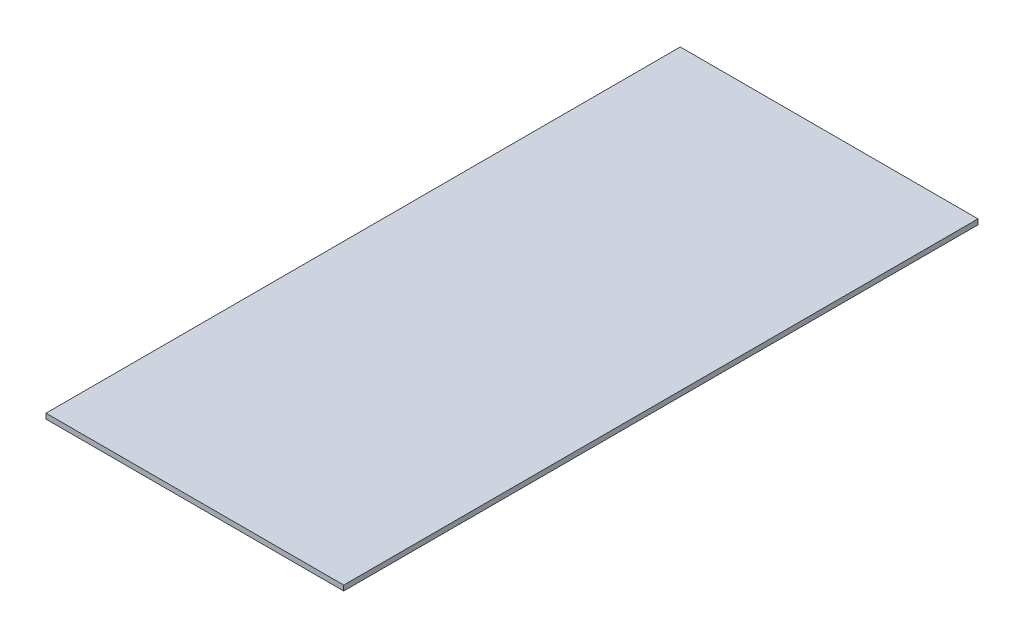
ISO-10303-21;
HEADER;
FILE_DESCRIPTION(('STEP AP214'),'2;1');
FILE_NAME('part.step','',(''),(''),'','','');
FILE_SCHEMA(('AUTOMOTIVE_DESIGN { 1 0 10303 214 1 1 1 1 }'));
ENDSEC;
DATA;
#1=APPLICATION_CONTEXT('core data for automotive mechanical design processes');
#2=APPLICATION_PROTOCOL_DEFINITION('international standard','automotive_design',2000,#1);
#3=PRODUCT_CONTEXT('',#1,'mechanical');
#4=PRODUCT('Part','Part','',(#3));
#5=PRODUCT_RELATED_PRODUCT_CATEGORY('part','',(#4));
#6=PRODUCT_DEFINITION_FORMATION('','',#4);
#7=PRODUCT_DEFINITION_CONTEXT('part definition',#1,'design');
#8=PRODUCT_DEFINITION('design','',#6,#7);
#9=PRODUCT_DEFINITION_SHAPE('','',#8);
#10=(LENGTH_UNIT() NAMED_UNIT(*) SI_UNIT(.MILLI.,.METRE.));
#11=(NAMED_UNIT(*) PLANE_ANGLE_UNIT() SI_UNIT($,.RADIAN.));
#12=(NAMED_UNIT(*) SI_UNIT($,.STERADIAN.) SOLID_ANGLE_UNIT());
#13=UNCERTAINTY_MEASURE_WITH_UNIT(LENGTH_MEASURE(1.E-05),#10,'distance_accuracy_value','');
#14=(GEOMETRIC_REPRESENTATION_CONTEXT(3) GLOBAL_UNCERTAINTY_ASSIGNED_CONTEXT((#13)) GLOBAL_UNIT_ASSIGNED_CONTEXT((#10,
#11,#12)) REPRESENTATION_CONTEXT('',''));
#15=CARTESIAN_POINT('',(0.,0.,0.));
#16=DIRECTION('',(0.,0.,1.));
#17=DIRECTION('',(1.,0.,0.));
#18=AXIS2_PLACEMENT_3D('',#15,#16,#17);
#19=CARTESIAN_POINT('',(0.,-4.,0.));
#20=DIRECTION('',(0.,-1.,0.));
#21=DIRECTION('',(0.,0.,-1.));
#22=AXIS2_PLACEMENT_3D('',#19,#20,#21);
#23=PLANE('',#22);
#24=DIRECTION('',(0.,0.,-1.));
#25=VECTOR('',#24,1.);
#26=CARTESIAN_POINT('',(230.,-4.,490.));
#27=LINE('',#26,#25);
#28=CARTESIAN_POINT('',(230.,-4.,490.));
#29=VERTEX_POINT('',#28);
#30=CARTESIAN_POINT('',(230.,-4.,-490.));
#31=VERTEX_POINT('',#30);
#32=EDGE_CURVE('E120',#29,#31,#27,.T.);
#33=ORIENTED_EDGE('',*,*,#32,.F.);
#34=DIRECTION('',(1.,0.,0.));
#35=VECTOR('',#34,1.);
#36=CARTESIAN_POINT('',(-230.,-4.,490.));
#37=LINE('',#36,#35);
#38=CARTESIAN_POINT('',(-230.,-4.,490.));
#39=VERTEX_POINT('',#38);
#40=EDGE_CURVE('E117',#39,#29,#37,.T.);
#41=ORIENTED_EDGE('',*,*,#40,.F.);
#42=DIRECTION('',(0.,0.,1.));
#43=VECTOR('',#42,1.);
#44=CARTESIAN_POINT('',(-230.,-4.,490.));
#45=LINE('',#44,#43);
#46=CARTESIAN_POINT('',(-230.,-4.,-490.));
#47=VERTEX_POINT('',#46);
#48=EDGE_CURVE('E236',#47,#39,#45,.T.);
#49=ORIENTED_EDGE('',*,*,#48,.F.);
#50=DIRECTION('',(-1.,0.,0.));
#51=VECTOR('',#50,1.);
#52=CARTESIAN_POINT('',(-230.,-4.,-490.));
#53=LINE('',#52,#51);
#54=EDGE_CURVE('E239',#31,#47,#53,.T.);
#55=ORIENTED_EDGE('',*,*,#54,.F.);
#56=EDGE_LOOP('',(#33,#41,#49,#55));
#57=FACE_BOUND('',#56,.T.);
#58=DIRECTION('',(-1.,0.,0.));
#59=VECTOR('',#58,1.);
#60=CARTESIAN_POINT('',(0.,-4.,-450.));
#61=LINE('',#60,#59);
#62=CARTESIAN_POINT('',(120.,-4.,-450.));
#63=VERTEX_POINT('',#62);
#64=CARTESIAN_POINT('',(17.9999999999999,-4.,-450.));
#65=VERTEX_POINT('',#64);
#66=EDGE_CURVE('E134',#63,#65,#61,.T.);
#67=ORIENTED_EDGE('',*,*,#66,.T.);
#68=DIRECTION('',(0.,0.,1.));
#69=VECTOR('',#68,1.);
#70=CARTESIAN_POINT('',(17.9999999999999,-4.,0.));
#71=LINE('',#70,#69);
#72=CARTESIAN_POINT('',(17.9999999999999,-4.,-230.));
#73=VERTEX_POINT('',#72);
#74=EDGE_CURVE('E138',#65,#73,#71,.T.);
#75=ORIENTED_EDGE('',*,*,#74,.T.);
#76=DIRECTION('',(1.,0.,0.));
#77=VECTOR('',#76,1.);
#78=CARTESIAN_POINT('',(0.,-4.,-230.));
#79=LINE('',#78,#77);
#80=CARTESIAN_POINT('',(120.,-4.,-230.));
#81=VERTEX_POINT('',#80);
#82=EDGE_CURVE('E121',#73,#81,#79,.T.);
#83=ORIENTED_EDGE('',*,*,#82,.T.);
#84=DIRECTION('',(0.,0.,-1.));
#85=VECTOR('',#84,1.);
#86=CARTESIAN_POINT('',(120.,-4.,0.));
#87=LINE('',#86,#85);
#88=EDGE_CURVE('E125',#81,#63,#87,.T.);
#89=ORIENTED_EDGE('',*,*,#88,.T.);
#90=EDGE_LOOP('',(#67,#75,#83,#89));
#91=FACE_BOUND('',#90,.T.);
#92=DIRECTION('',(1.,0.,0.));
#93=VECTOR('',#92,1.);
#94=CARTESIAN_POINT('',(0.,-4.,400.));
#95=LINE('',#94,#93);
#96=CARTESIAN_POINT('',(-200.,-4.,400.));
#97=VERTEX_POINT('',#96);
#98=CARTESIAN_POINT('',(200.,-4.,400.));
#99=VERTEX_POINT('',#98);
#100=EDGE_CURVE('E45',#97,#99,#95,.T.);
#101=ORIENTED_EDGE('',*,*,#100,.T.);
#102=DIRECTION('',(0.,0.,-1.));
#103=VECTOR('',#102,1.);
#104=CARTESIAN_POINT('',(200.,-4.,0.));
#105=LINE('',#104,#103);
#106=CARTESIAN_POINT('',(200.,-4.,50.));
#107=VERTEX_POINT('',#106);
#108=EDGE_CURVE('E11',#99,#107,#105,.T.);
#109=ORIENTED_EDGE('',*,*,#108,.T.);
#110=DIRECTION('',(-1.,0.,0.));
#111=VECTOR('',#110,1.);
#112=CARTESIAN_POINT('',(0.,-4.,50.));
#113=LINE('',#112,#111);
#114=CARTESIAN_POINT('',(-200.,-4.,50.));
#115=VERTEX_POINT('',#114);
#116=EDGE_CURVE('E141',#107,#115,#113,.T.);
#117=ORIENTED_EDGE('',*,*,#116,.T.);
#118=DIRECTION('',(0.,0.,1.));
#119=VECTOR('',#118,1.);
#120=CARTESIAN_POINT('',(-200.,-4.,0.));
#121=LINE('',#120,#119);
#122=EDGE_CURVE('E145',#115,#97,#121,.T.);
#123=ORIENTED_EDGE('',*,*,#122,.T.);
#124=EDGE_LOOP('',(#101,#109,#117,#123));
#125=FACE_BOUND('',#124,.T.);
#126=ADVANCED_FACE('F36',(#57,#91,#125),#23,.T.);
#127=ORIENTED_EDGE('',*,*,#108,.F.);
#128=ORIENTED_EDGE('',*,*,#100,.F.);
#129=ORIENTED_EDGE('',*,*,#122,.F.);
#130=ORIENTED_EDGE('',*,*,#116,.F.);
#131=EDGE_LOOP('',(#127,#128,#129,#130));
#132=FACE_BOUND('',#131,.T.);
#133=ADVANCED_FACE('F151',(#132),#23,.T.);
#134=CARTESIAN_POINT('',(230.,4.,490.));
#135=DIRECTION('',(-1.,0.,0.));
#136=DIRECTION('',(0.,0.,1.));
#137=AXIS2_PLACEMENT_3D('',#134,#135,#136);
#138=PLANE('',#137);
#139=ORIENTED_EDGE('',*,*,#32,.T.);
#140=DIRECTION('',(0.,-1.,0.));
#141=VECTOR('',#140,1.);
#142=CARTESIAN_POINT('',(230.,4.,-490.));
#143=LINE('',#142,#141);
#144=CARTESIAN_POINT('',(230.,4.,-490.));
#145=VERTEX_POINT('',#144);
#146=EDGE_CURVE('E101',#145,#31,#143,.T.);
#147=ORIENTED_EDGE('',*,*,#146,.F.);
#148=DIRECTION('',(0.,0.,-1.));
#149=VECTOR('',#148,1.);
#150=CARTESIAN_POINT('',(230.,4.,490.));
#151=LINE('',#150,#149);
#152=CARTESIAN_POINT('',(230.,4.,490.));
#153=VERTEX_POINT('',#152);
#154=EDGE_CURVE('E108',#153,#145,#151,.T.);
#155=ORIENTED_EDGE('',*,*,#154,.F.);
#156=DIRECTION('',(0.,-1.,0.));
#157=VECTOR('',#156,1.);
#158=CARTESIAN_POINT('',(230.,4.,490.));
#159=LINE('',#158,#157);
#160=EDGE_CURVE('E233',#153,#29,#159,.T.);
#161=ORIENTED_EDGE('',*,*,#160,.T.);
#162=EDGE_LOOP('',(#139,#147,#155,#161));
#163=FACE_BOUND('',#162,.T.);
#164=ADVANCED_FACE('F38',(#163),#138,.F.);
#165=CARTESIAN_POINT('',(-230.,4.,-490.));
#166=DIRECTION('',(0.,0.,1.));
#167=DIRECTION('',(1.,0.,0.));
#168=AXIS2_PLACEMENT_3D('',#165,#166,#167);
#169=PLANE('',#168);
#170=ORIENTED_EDGE('',*,*,#54,.T.);
#171=DIRECTION('',(0.,-1.,0.));
#172=VECTOR('',#171,1.);
#173=CARTESIAN_POINT('',(-230.,4.,-490.));
#174=LINE('',#173,#172);
#175=CARTESIAN_POINT('',(-230.,4.,-490.));
#176=VERTEX_POINT('',#175);
#177=EDGE_CURVE('E104',#176,#47,#174,.T.);
#178=ORIENTED_EDGE('',*,*,#177,.F.);
#179=DIRECTION('',(-1.,0.,0.));
#180=VECTOR('',#179,1.);
#181=CARTESIAN_POINT('',(-230.,4.,-490.));
#182=LINE('',#181,#180);
#183=EDGE_CURVE('E97',#145,#176,#182,.T.);
#184=ORIENTED_EDGE('',*,*,#183,.F.);
#185=ORIENTED_EDGE('',*,*,#146,.T.);
#186=EDGE_LOOP('',(#170,#178,#184,#185));
#187=FACE_BOUND('',#186,.T.);
#188=ADVANCED_FACE('F99',(#187),#169,.F.);
#189=CARTESIAN_POINT('',(-230.,4.,490.));
#190=DIRECTION('',(1.,0.,0.));
#191=DIRECTION('',(0.,0.,-1.));
#192=AXIS2_PLACEMENT_3D('',#189,#190,#191);
#193=PLANE('',#192);
#194=ORIENTED_EDGE('',*,*,#48,.T.);
#195=DIRECTION('',(0.,-1.,0.));
#196=VECTOR('',#195,1.);
#197=CARTESIAN_POINT('',(-230.,4.,490.));
#198=LINE('',#197,#196);
#199=CARTESIAN_POINT('',(-230.,4.,490.));
#200=VERTEX_POINT('',#199);
#201=EDGE_CURVE('E127',#200,#39,#198,.T.);
#202=ORIENTED_EDGE('',*,*,#201,.F.);
#203=DIRECTION('',(0.,0.,1.));
#204=VECTOR('',#203,1.);
#205=CARTESIAN_POINT('',(-230.,4.,490.));
#206=LINE('',#205,#204);
#207=EDGE_CURVE('E107',#176,#200,#206,.T.);
#208=ORIENTED_EDGE('',*,*,#207,.F.);
#209=ORIENTED_EDGE('',*,*,#177,.T.);
#210=EDGE_LOOP('',(#194,#202,#208,#209));
#211=FACE_BOUND('',#210,.T.);
#212=ADVANCED_FACE('F175',(#211),#193,.F.);
#213=CARTESIAN_POINT('',(-230.,4.,490.));
#214=DIRECTION('',(0.,0.,-1.));
#215=DIRECTION('',(-1.,0.,0.));
#216=AXIS2_PLACEMENT_3D('',#213,#214,#215);
#217=PLANE('',#216);
#218=ORIENTED_EDGE('',*,*,#40,.T.);
#219=ORIENTED_EDGE('',*,*,#160,.F.);
#220=DIRECTION('',(1.,0.,0.));
#221=VECTOR('',#220,1.);
#222=CARTESIAN_POINT('',(-230.,4.,490.));
#223=LINE('',#222,#221);
#224=EDGE_CURVE('E113',#200,#153,#223,.T.);
#225=ORIENTED_EDGE('',*,*,#224,.F.);
#226=ORIENTED_EDGE('',*,*,#201,.T.);
#227=EDGE_LOOP('',(#218,#219,#225,#226));
#228=FACE_BOUND('',#227,.T.);
#229=ADVANCED_FACE('F168',(#228),#217,.F.);
#230=CARTESIAN_POINT('',(0.,4.,0.));
#231=DIRECTION('',(0.,-1.,0.));
#232=DIRECTION('',(0.,0.,-1.));
#233=AXIS2_PLACEMENT_3D('',#230,#231,#232);
#234=PLANE('',#233);
#235=ORIENTED_EDGE('',*,*,#154,.T.);
#236=ORIENTED_EDGE('',*,*,#183,.T.);
#237=ORIENTED_EDGE('',*,*,#207,.T.);
#238=ORIENTED_EDGE('',*,*,#224,.T.);
#239=EDGE_LOOP('',(#235,#236,#237,#238));
#240=FACE_BOUND('',#239,.T.);
#241=ADVANCED_FACE('F111',(#240),#234,.F.);
#242=ORIENTED_EDGE('',*,*,#74,.F.);
#243=ORIENTED_EDGE('',*,*,#66,.F.);
#244=ORIENTED_EDGE('',*,*,#88,.F.);
#245=ORIENTED_EDGE('',*,*,#82,.F.);
#246=EDGE_LOOP('',(#242,#243,#244,#245));
#247=FACE_BOUND('',#246,.T.);
#248=ADVANCED_FACE('F154',(#247),#23,.T.);
#249=CLOSED_SHELL('',(#126,#133,#164,#188,#212,#229,#241,#248));
#250=MANIFOLD_SOLID_BREP('B2',#249);
#251=ADVANCED_BREP_SHAPE_REPRESENTATION('',(#18,#250),#14);
#252=SHAPE_DEFINITION_REPRESENTATION(#9,#251);
ENDSEC;
END-ISO-10303-21;
